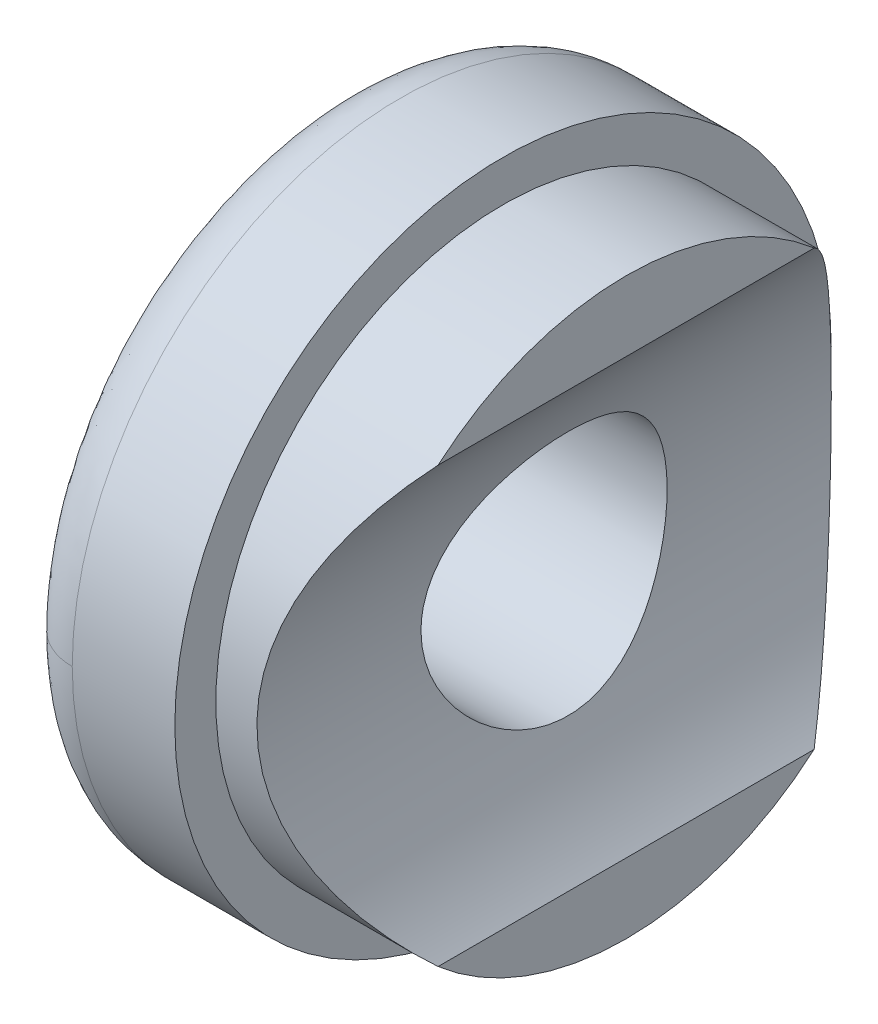
ISO-10303-21;
HEADER;
FILE_DESCRIPTION(('STEP AP214'),'2;1');
FILE_NAME('part.step','',(''),(''),'','','');
FILE_SCHEMA(('AUTOMOTIVE_DESIGN { 1 0 10303 214 1 1 1 1 }'));
ENDSEC;
DATA;
#1=APPLICATION_CONTEXT('core data for automotive mechanical design processes');
#2=APPLICATION_PROTOCOL_DEFINITION('international standard','automotive_design',2000,#1);
#3=PRODUCT_CONTEXT('',#1,'mechanical');
#4=PRODUCT('Part','Part','',(#3));
#5=PRODUCT_RELATED_PRODUCT_CATEGORY('part','',(#4));
#6=PRODUCT_DEFINITION_FORMATION('','',#4);
#7=PRODUCT_DEFINITION_CONTEXT('part definition',#1,'design');
#8=PRODUCT_DEFINITION('design','',#6,#7);
#9=PRODUCT_DEFINITION_SHAPE('','',#8);
#10=(LENGTH_UNIT() NAMED_UNIT(*) SI_UNIT(.MILLI.,.METRE.));
#11=(NAMED_UNIT(*) PLANE_ANGLE_UNIT() SI_UNIT($,.RADIAN.));
#12=(NAMED_UNIT(*) SI_UNIT($,.STERADIAN.) SOLID_ANGLE_UNIT());
#13=UNCERTAINTY_MEASURE_WITH_UNIT(LENGTH_MEASURE(1.E-05),#10,'distance_accuracy_value','');
#14=(GEOMETRIC_REPRESENTATION_CONTEXT(3) GLOBAL_UNCERTAINTY_ASSIGNED_CONTEXT((#13)) GLOBAL_UNIT_ASSIGNED_CONTEXT((#10,
#11,#12)) REPRESENTATION_CONTEXT('',''));
#15=CARTESIAN_POINT('',(0.,0.,0.));
#16=DIRECTION('',(0.,0.,1.));
#17=DIRECTION('',(1.,0.,0.));
#18=AXIS2_PLACEMENT_3D('',#15,#16,#17);
#19=CARTESIAN_POINT('',(-2.,0.,0.));
#20=DIRECTION('',(1.,0.,0.));
#21=DIRECTION('',(0.,0.,-1.));
#22=AXIS2_PLACEMENT_3D('',#19,#20,#21);
#23=CYLINDRICAL_SURFACE('',#22,8.);
#24=CARTESIAN_POINT('',(-2.00000000069092,0.,0.));
#25=DIRECTION('',(-1.,0.,0.));
#26=DIRECTION('',(0.,-1.,0.));
#27=AXIS2_PLACEMENT_3D('',#24,#25,#26);
#28=CIRCLE('',#27,8.00000000006114);
#29=CARTESIAN_POINT('',(-2.00000000069092,-3.59174513714932E-10,-8.00000000004586));
#30=VERTEX_POINT('',#29);
#31=CARTESIAN_POINT('',(-2.00000000069092,-1.23062057109355E-09,8.00000000004585));
#32=VERTEX_POINT('',#31);
#33=EDGE_CURVE('E79',#30,#32,#28,.T.);
#34=ORIENTED_EDGE('',*,*,#33,.F.);
#35=CARTESIAN_POINT('',(-2.00000000069092,0.,0.));
#36=DIRECTION('',(-1.,0.,0.));
#37=DIRECTION('',(0.,-1.,0.));
#38=AXIS2_PLACEMENT_3D('',#35,#36,#37);
#39=CIRCLE('',#38,8.00000000006114);
#40=EDGE_CURVE('E75',#32,#30,#39,.T.);
#41=ORIENTED_EDGE('',*,*,#40,.F.);
#42=EDGE_LOOP('',(#34,#41));
#43=FACE_BOUND('',#42,.T.);
#44=CARTESIAN_POINT('',(0.5,0.,0.));
#45=DIRECTION('',(1.,0.,0.));
#46=DIRECTION('',(0.,0.,-1.));
#47=AXIS2_PLACEMENT_3D('',#44,#45,#46);
#48=CIRCLE('',#47,8.);
#49=CARTESIAN_POINT('',(0.5,0.,-8.));
#50=VERTEX_POINT('',#49);
#51=EDGE_CURVE('E22',#50,#50,#48,.T.);
#52=ORIENTED_EDGE('',*,*,#51,.F.);
#53=EDGE_LOOP('',(#52));
#54=FACE_BOUND('',#53,.T.);
#55=ADVANCED_FACE('F17',(#43,#54),#23,.T.);
#56=CARTESIAN_POINT('',(0.5,-8.096,8.096));
#57=DIRECTION('',(1.,0.,0.));
#58=DIRECTION('',(0.,0.,-1.));
#59=AXIS2_PLACEMENT_3D('',#56,#57,#58);
#60=PLANE('',#59);
#61=CARTESIAN_POINT('',(0.5,0.,0.));
#62=DIRECTION('',(1.,0.,0.));
#63=DIRECTION('',(0.,0.,-1.));
#64=AXIS2_PLACEMENT_3D('',#61,#62,#63);
#65=CIRCLE('',#64,7.);
#66=CARTESIAN_POINT('',(0.5,0.,-7.));
#67=VERTEX_POINT('',#66);
#68=EDGE_CURVE('E69',#67,#67,#65,.F.);
#69=ORIENTED_EDGE('',*,*,#68,.T.);
#70=EDGE_LOOP('',(#69));
#71=FACE_BOUND('',#70,.T.);
#72=ORIENTED_EDGE('',*,*,#51,.T.);
#73=EDGE_LOOP('',(#72));
#74=FACE_BOUND('',#73,.T.);
#75=ADVANCED_FACE('F119',(#71,#74),#60,.T.);
#76=CARTESIAN_POINT('',(-1.850249875,0.,-7.992506248));
#77=CARTESIAN_POINT('',(-1.850249875,15.985012496,-7.992506248));
#78=CARTESIAN_POINT('',(-1.850249875,15.985012496,7.992506248));
#79=CARTESIAN_POINT('',(-1.850249875,0.,7.992506248));
#80=CARTESIAN_POINT('',(-2.870080648,0.,-8.094830634));
#81=CARTESIAN_POINT('',(-2.870080648,16.189661268,-8.094830634));
#82=CARTESIAN_POINT('',(-2.870080648,16.189661268,8.094830634));
#83=CARTESIAN_POINT('',(-2.870080648,0.,8.094830634));
#84=CARTESIAN_POINT('',(-3.594830634,0.,-7.37008064800001));
#85=CARTESIAN_POINT('',(-3.594830634,14.740161296,-7.370080648));
#86=CARTESIAN_POINT('',(-3.594830634,14.740161296,7.370080648));
#87=CARTESIAN_POINT('',(-3.594830634,0.,7.37008064800001));
#88=CARTESIAN_POINT('',(-3.492506248,0.,-6.350249875));
#89=CARTESIAN_POINT('',(-3.492506248,12.70049975,-6.350249875));
#90=CARTESIAN_POINT('',(-3.492506248,12.70049975,6.350249875));
#91=CARTESIAN_POINT('',(-3.492506248,0.,6.350249875));
#92=(BOUNDED_SURFACE() B_SPLINE_SURFACE(3,3,((#76,#77,#78,#79),(#80,#81,#82,#83),(#84,#85,#86,
#87),(#88,#89,#90,#91)),.UNSPECIFIED.,.F.,.F.,.F.) B_SPLINE_SURFACE_WITH_KNOTS((4,4),(4,4),(0.,
1.),(0.,1.),.UNSPECIFIED.) GEOMETRIC_REPRESENTATION_ITEM() RATIONAL_B_SPLINE_SURFACE(((1.,
0.333333333333333,0.333333333333333,1.),(0.755320871117969,0.25177362370599,0.25177362370599,
0.755320871117969),(0.755320871117969,0.25177362370599,0.25177362370599,0.755320871117969),(1.,
0.333333333333333,0.333333333333333,1.))) REPRESENTATION_ITEM('') SURFACE());
#93=CARTESIAN_POINT('',(-1.850249875,0.,-7.992506248));
#94=CARTESIAN_POINT('',(-2.870080648,0.,-8.094830634));
#95=CARTESIAN_POINT('',(-3.594830634,0.,-7.37008064800001));
#96=CARTESIAN_POINT('',(-3.492506248,0.,-6.350249875));
#97=(BOUNDED_CURVE() B_SPLINE_CURVE(3,(#93,#94,#95,#96),.UNSPECIFIED.,.F.,
.F.) B_SPLINE_CURVE_WITH_KNOTS((4,4),(0.,1.),
.UNSPECIFIED.) CURVE() GEOMETRIC_REPRESENTATION_ITEM() RATIONAL_B_SPLINE_CURVE((1.,
0.755320871117969,0.755320871117969,1.)) REPRESENTATION_ITEM(''));
#98=CARTESIAN_POINT('',(-3.50000000003669,0.,-6.49999999912502));
#99=VERTEX_POINT('',#98);
#100=EDGE_CURVE('E73',#99,#30,#97,.F.);
#101=CARTESIAN_POINT('',(-3.50000000006114,0.,-6.50000000069108));
#102=CARTESIAN_POINT('',(-3.50000000006114,13.0000000013822,-6.50000000069108));
#103=CARTESIAN_POINT('',(-3.50000000006114,13.0000000013822,6.50000000069108));
#104=CARTESIAN_POINT('',(-3.50000000006114,0.,6.50000000069108));
#105=(BOUNDED_CURVE() B_SPLINE_CURVE(3,(#101,#102,#103,#104),.UNSPECIFIED.,.F.,
.F.) B_SPLINE_CURVE_WITH_KNOTS((4,4),(0.,1.),
.UNSPECIFIED.) CURVE() GEOMETRIC_REPRESENTATION_ITEM() RATIONAL_B_SPLINE_CURVE((0.95657830216595,
0.318859434055316,0.318859434055316,0.95657830216595)) REPRESENTATION_ITEM(''));
#106=CARTESIAN_POINT('',(-3.50000000003669,0.,6.49999999912502));
#107=VERTEX_POINT('',#106);
#108=EDGE_CURVE('E60',#107,#99,#105,.F.);
#109=CARTESIAN_POINT('',(-1.850249875,0.,7.992506248));
#110=CARTESIAN_POINT('',(-2.870080648,0.,8.094830634));
#111=CARTESIAN_POINT('',(-3.594830634,0.,7.37008064800001));
#112=CARTESIAN_POINT('',(-3.492506248,0.,6.350249875));
#113=(BOUNDED_CURVE() B_SPLINE_CURVE(3,(#109,#110,#111,#112),.UNSPECIFIED.,.F.,
.F.) B_SPLINE_CURVE_WITH_KNOTS((4,4),(0.,1.),
.UNSPECIFIED.) CURVE() GEOMETRIC_REPRESENTATION_ITEM() RATIONAL_B_SPLINE_CURVE((1.,
0.755320871117969,0.755320871117969,1.)) REPRESENTATION_ITEM(''));
#114=EDGE_CURVE('E80',#32,#107,#113,.T.);
#115=ORIENTED_EDGE('',*,*,#40,.T.);
#116=ORIENTED_EDGE('',*,*,#100,.F.);
#117=ORIENTED_EDGE('',*,*,#108,.F.);
#118=ORIENTED_EDGE('',*,*,#114,.F.);
#119=EDGE_LOOP('',(#115,#116,#117,#118));
#120=FACE_BOUND('',#119,.T.);
#121=ADVANCED_FACE('F74',(#120),#92,.T.);
#122=CARTESIAN_POINT('',(-1.850249875,0.,7.992506248));
#123=CARTESIAN_POINT('',(-1.850249875,-15.985012496,7.992506248));
#124=CARTESIAN_POINT('',(-1.850249875,-15.985012496,-7.992506248));
#125=CARTESIAN_POINT('',(-1.850249875,0.,-7.992506248));
#126=CARTESIAN_POINT('',(-2.870080648,0.,8.094830634));
#127=CARTESIAN_POINT('',(-2.870080648,-16.189661268,8.094830634));
#128=CARTESIAN_POINT('',(-2.870080648,-16.189661268,-8.094830634));
#129=CARTESIAN_POINT('',(-2.870080648,0.,-8.094830634));
#130=CARTESIAN_POINT('',(-3.594830634,0.,7.37008064800001));
#131=CARTESIAN_POINT('',(-3.594830634,-14.740161296,7.370080648));
#132=CARTESIAN_POINT('',(-3.594830634,-14.740161296,-7.370080648));
#133=CARTESIAN_POINT('',(-3.594830634,0.,-7.37008064800001));
#134=CARTESIAN_POINT('',(-3.492506248,0.,6.350249875));
#135=CARTESIAN_POINT('',(-3.492506248,-12.70049975,6.350249875));
#136=CARTESIAN_POINT('',(-3.492506248,-12.70049975,-6.350249875));
#137=CARTESIAN_POINT('',(-3.492506248,0.,-6.350249875));
#138=(BOUNDED_SURFACE() B_SPLINE_SURFACE(3,3,((#122,#123,#124,#125),(#126,#127,#128,#129),(#130,
#131,#132,#133),(#134,#135,#136,#137)),.UNSPECIFIED.,.F.,.F.,
.F.) B_SPLINE_SURFACE_WITH_KNOTS((4,4),(4,4),(0.,1.),(0.,1.),
.UNSPECIFIED.) GEOMETRIC_REPRESENTATION_ITEM() RATIONAL_B_SPLINE_SURFACE(((1.,0.333333333333333,
0.333333333333333,1.),(0.755320871117969,0.25177362370599,0.25177362370599,0.755320871117969),
(0.755320871117969,0.25177362370599,0.25177362370599,0.755320871117969),(1.,0.333333333333333,
0.333333333333333,1.))) REPRESENTATION_ITEM('') SURFACE());
#139=CARTESIAN_POINT('',(-3.50000000006114,0.,6.50000000069108));
#140=CARTESIAN_POINT('',(-3.50000000006114,-13.0000000013822,6.50000000069108));
#141=CARTESIAN_POINT('',(-3.50000000006114,-13.0000000013822,-6.50000000069108));
#142=CARTESIAN_POINT('',(-3.50000000006114,0.,-6.50000000069108));
#143=(BOUNDED_CURVE() B_SPLINE_CURVE(3,(#139,#140,#141,#142),.UNSPECIFIED.,.F.,
.F.) B_SPLINE_CURVE_WITH_KNOTS((4,4),(0.,1.),
.UNSPECIFIED.) CURVE() GEOMETRIC_REPRESENTATION_ITEM() RATIONAL_B_SPLINE_CURVE((0.95657830216595,
0.318859434055316,0.318859434055316,0.95657830216595)) REPRESENTATION_ITEM(''));
#144=EDGE_CURVE('E64',#99,#107,#143,.F.);
#145=ORIENTED_EDGE('',*,*,#100,.T.);
#146=ORIENTED_EDGE('',*,*,#33,.T.);
#147=ORIENTED_EDGE('',*,*,#114,.T.);
#148=ORIENTED_EDGE('',*,*,#144,.F.);
#149=EDGE_LOOP('',(#145,#146,#147,#148));
#150=FACE_BOUND('',#149,.T.);
#151=ADVANCED_FACE('F83',(#150),#138,.T.);
#152=CARTESIAN_POINT('',(3.5,5.291502622,4.637566603));
#153=DIRECTION('',(1.,0.,0.));
#154=DIRECTION('',(0.,0.,-1.));
#155=AXIS2_PLACEMENT_3D('',#152,#153,#154);
#156=PLANE('',#155);
#157=DIRECTION('',(0.,0.,-1.));
#158=VECTOR('',#157,1.);
#159=CARTESIAN_POINT('',(3.49999999881671,5.29150262078745,0.));
#160=LINE('',#159,#158);
#161=CARTESIAN_POINT('',(3.49999999926326,5.29150262129379,-4.58257569592046));
#162=VERTEX_POINT('',#161);
#163=CARTESIAN_POINT('',(3.49999999940836,5.29150262145832,4.58257569573049));
#164=VERTEX_POINT('',#163);
#165=EDGE_CURVE('E84',#162,#164,#160,.F.);
#166=ORIENTED_EDGE('',*,*,#165,.F.);
#167=CARTESIAN_POINT('',(3.5,0.,0.));
#168=DIRECTION('',(1.,0.,0.));
#169=DIRECTION('',(0.,0.,-1.));
#170=AXIS2_PLACEMENT_3D('',#167,#168,#169);
#171=CIRCLE('',#170,7.);
#172=EDGE_CURVE('E140',#162,#164,#171,.T.);
#173=ORIENTED_EDGE('',*,*,#172,.T.);
#174=EDGE_LOOP('',(#166,#173));
#175=FACE_BOUND('',#174,.T.);
#176=ADVANCED_FACE('F105',(#175),#156,.T.);
#177=CARTESIAN_POINT('',(3.5,-7.010250984,4.637566603));
#178=DIRECTION('',(1.,0.,0.));
#179=DIRECTION('',(0.,0.,-1.));
#180=AXIS2_PLACEMENT_3D('',#177,#178,#179);
#181=PLANE('',#180);
#182=DIRECTION('',(0.,0.,1.));
#183=VECTOR('',#182,1.);
#184=CARTESIAN_POINT('',(3.49999999786642,-5.29150261970993,0.));
#185=LINE('',#184,#183);
#186=CARTESIAN_POINT('',(3.49999999895033,-5.29150262093897,4.58257569633018));
#187=VERTEX_POINT('',#186);
#188=CARTESIAN_POINT('',(3.49999999893321,-5.29150262091956,-4.58257569635259));
#189=VERTEX_POINT('',#188);
#190=EDGE_CURVE('E87',#187,#189,#185,.F.);
#191=ORIENTED_EDGE('',*,*,#190,.F.);
#192=CARTESIAN_POINT('',(3.5,0.,0.));
#193=DIRECTION('',(1.,0.,0.));
#194=DIRECTION('',(0.,0.,-1.));
#195=AXIS2_PLACEMENT_3D('',#192,#193,#194);
#196=CIRCLE('',#195,7.);
#197=EDGE_CURVE('E40',#187,#189,#196,.T.);
#198=ORIENTED_EDGE('',*,*,#197,.T.);
#199=EDGE_LOOP('',(#191,#198));
#200=FACE_BOUND('',#199,.T.);
#201=ADVANCED_FACE('F180',(#200),#181,.T.);
#202=CARTESIAN_POINT('',(0.5,0.,0.));
#203=DIRECTION('',(1.,0.,0.));
#204=DIRECTION('',(0.,0.,-1.));
#205=AXIS2_PLACEMENT_3D('',#202,#203,#204);
#206=CYLINDRICAL_SURFACE('',#205,7.);
#207=CARTESIAN_POINT('',(3.49999999834896,-5.29150261997508,-4.58257569715826));
#208=CARTESIAN_POINT('',(3.39293276986871,-5.1701150149516,-4.72270241835805));
#209=CARTESIAN_POINT('',(3.28710450214324,-5.04267455661963,-4.85864361556702));
#210=CARTESIAN_POINT('',(3.07941258862584,-4.7754265608018,-5.12158137414986));
#211=CARTESIAN_POINT('',(2.97755498296647,-4.63560116550926,-5.24856452931498));
#212=CARTESIAN_POINT('',(2.77874001318861,-4.34238749711448,-5.49367554355323));
#213=CARTESIAN_POINT('',(2.68183391095157,-4.18889028135742,-5.61171522510102));
#214=CARTESIAN_POINT('',(2.49567795956176,-3.86957247182716,-5.83648018194059));
#215=CARTESIAN_POINT('',(2.40642357120779,-3.70375929472177,-5.94321217424312));
#216=CARTESIAN_POINT('',(2.25440801354188,-3.39481381284013,-6.12376235305814));
#217=CARTESIAN_POINT('',(2.18993612299809,-3.25386105258591,-6.19987513179683));
#218=CARTESIAN_POINT('',(2.06794253163277,-2.96464827389084,-6.34325612642747));
#219=CARTESIAN_POINT('',(2.01041935672737,-2.81638981469223,-6.41052621845371));
#220=CARTESIAN_POINT('',(1.90346049053483,-2.51361760227211,-6.53516886834449));
#221=CARTESIAN_POINT('',(1.85399685047825,-2.35912788869628,-6.59257566946591));
#222=CARTESIAN_POINT('',(1.76383869063227,-2.04416821358017,-6.69693084658516));
#223=CARTESIAN_POINT('',(1.72314280673338,-1.88369918687982,-6.74388084951633));
#224=CARTESIAN_POINT('',(1.65677901175357,-1.58239207290761,-6.82029448072479));
#225=CARTESIAN_POINT('',(1.62977007930605,-1.4422454612337,-6.85132768738137));
#226=CARTESIAN_POINT('',(1.58311992943218,-1.15913073720528,-6.90486516805794));
#227=CARTESIAN_POINT('',(1.56347775651503,-1.01616299329382,-6.92737054816652));
#228=CARTESIAN_POINT('',(1.53188757949636,-0.728140942873773,-6.96354028564235));
#229=CARTESIAN_POINT('',(1.51994613884011,-0.583084963884133,-6.97719710129709));
#230=CARTESIAN_POINT('',(1.5040034170314,-0.29202200521957,-6.99542569449536));
#231=CARTESIAN_POINT('',(1.4999993246924,-0.146015380624692,-7.00000068856661));
#232=CARTESIAN_POINT('',(1.5000007577628,0.163843886618532,-6.99999922735926));
#233=CARTESIAN_POINT('',(1.50504395404564,0.327698797691865,-6.99423717206129));
#234=CARTESIAN_POINT('',(1.52510089817905,0.653996959987093,-6.97130160883884));
#235=CARTESIAN_POINT('',(1.5401155759196,0.816440078120875,-6.95412703664063));
#236=CARTESIAN_POINT('',(1.57977082990941,1.13855155485252,-6.90870123705652));
#237=CARTESIAN_POINT('',(1.60441035441661,1.29822021463508,-6.88045121992361));
#238=CARTESIAN_POINT('',(1.6627815991057,1.61360927429987,-6.81338860049591));
#239=CARTESIAN_POINT('',(1.69651325100418,1.76932970382438,-6.77457607752733));
#240=CARTESIAN_POINT('',(1.77212481757097,2.07473038309513,-6.68734070479756));
#241=CARTESIAN_POINT('',(1.81394398883796,2.22444619329465,-6.63898944688056));
#242=CARTESIAN_POINT('',(1.90513619147715,2.51828398046551,-6.53319755950115));
#243=CARTESIAN_POINT('',(1.95451257321422,2.66240344068341,-6.47575289823902));
#244=CARTESIAN_POINT('',(2.11303348067924,3.08602845982268,-6.29057955014647));
#245=CARTESIAN_POINT('',(2.23245047890723,3.35633339978091,-6.15014799639861));
#246=CARTESIAN_POINT('',(2.4446808522743,3.77571797871992,-5.89748717444974));
#247=CARTESIAN_POINT('',(2.53139198448218,3.93315473648031,-5.79355433260072));
#248=CARTESIAN_POINT('',(2.71168946856017,4.23674073705094,-5.57538615907143));
#249=CARTESIAN_POINT('',(2.80527943311123,4.38288396478436,-5.4611454065262));
#250=CARTESIAN_POINT('',(2.99708352405738,4.66268830409955,-5.22424757570667));
#251=CARTESIAN_POINT('',(3.09526139877821,4.79642838817299,-5.10165382180007));
#252=CARTESIAN_POINT('',(3.29524649768755,5.05246540279179,-4.84818494223726));
#253=CARTESIAN_POINT('',(3.39704890736049,5.17477678460411,-4.71732063552042));
#254=CARTESIAN_POINT('',(3.49999999851853,5.29150262044936,-4.58257569689553));
#255=B_SPLINE_CURVE_WITH_KNOTS('',3,(#207,#208,#209,#210,#211,#212,#213,#214,#215,#216,#217,
#218,#219,#220,#221,#222,#223,#224,#225,#226,#227,#228,#229,#230,#231,#232,#233,#234,#235,#236,
#237,#238,#239,#240,#241,#242,#243,#244,#245,#246,#247,#248,#249,#250,#251,#252,#253,#254),
.UNSPECIFIED.,.F.,.F.,(4,2,2,2,2,2,2,2,2,2,2,2,2,2,2,2,2,2,2,2,2,2,2,4),(0.,0.642245620859644,
1.28543285723364,1.93430433516148,2.5827881824223,3.10034798975225,3.61779780965235,
4.13341316650055,4.64894824459456,5.0866931138393,5.52438118661054,5.96244181591311,
6.40034726866698,6.89172106958792,7.3831406999818,7.87450664617749,8.3658689022339,
8.85367472835332,9.34169744495156,10.319230444829,10.9415304972408,11.5641597422595,
12.1825045170628,12.8000565209903),.UNSPECIFIED.);
#256=EDGE_CURVE('E35',#189,#162,#255,.T.);
#257=ORIENTED_EDGE('',*,*,#256,.F.);
#258=ORIENTED_EDGE('',*,*,#197,.F.);
#259=CARTESIAN_POINT('',(3.49999999822854,5.29150262044347,4.58257569722861));
#260=CARTESIAN_POINT('',(3.39293276988479,5.17011501519132,4.72270241830707));
#261=CARTESIAN_POINT('',(3.28710450221702,5.04267455677053,4.85864361546487));
#262=CARTESIAN_POINT('',(3.07941258874234,4.77542656089565,5.12158137401115));
#263=CARTESIAN_POINT('',(2.97755498306799,4.63560116563476,5.24856452919075));
#264=CARTESIAN_POINT('',(2.77874001327541,4.34238749726693,5.49367554344526));
#265=CARTESIAN_POINT('',(2.68183391103893,4.18889028150457,5.61171522499444));
#266=CARTESIAN_POINT('',(2.49567795964571,3.86957247197388,5.83648018184031));
#267=CARTESIAN_POINT('',(2.4064235712877,3.70375929487348,5.94321217414786));
#268=CARTESIAN_POINT('',(2.25440801361442,3.39481381299608,6.12376235297226));
#269=CARTESIAN_POINT('',(2.18993612306719,3.25386105274153,6.19987513171535));
#270=CARTESIAN_POINT('',(2.06794253169461,2.96464827404565,6.34325612635504));
#271=CARTESIAN_POINT('',(2.01041935678539,2.81638981484657,6.41052621838594));
#272=CARTESIAN_POINT('',(1.9034604905852,2.5136176024246,6.53516886828594));
#273=CARTESIAN_POINT('',(1.85399685052481,2.35912788884737,6.59257566941192));
#274=CARTESIAN_POINT('',(1.7638386906713,2.04416821372806,6.69693084654009));
#275=CARTESIAN_POINT('',(1.72314280676869,1.88369918702591,6.74388084947562));
#276=CARTESIAN_POINT('',(1.65677901170172,1.58239207268428,6.82029448078454));
#277=CARTESIAN_POINT('',(1.62977007918903,1.44224546063349,6.85132768751585));
#278=CARTESIAN_POINT('',(1.58311992922502,1.15913073583808,6.90486516829552));
#279=CARTESIAN_POINT('',(1.5634777562829,1.01616299153654,6.92737054843248));
#280=CARTESIAN_POINT('',(1.53188757925679,0.728140940330037,6.96354028591648));
#281=CARTESIAN_POINT('',(1.51994613861811,0.583084960944019,6.97719710155099));
#282=CARTESIAN_POINT('',(1.50400341688803,0.292022001489367,6.99542569465923));
#283=CARTESIAN_POINT('',(1.49999932461005,0.146015376500781,7.00000068866072));
#284=CARTESIAN_POINT('',(1.5000007578552,-0.163843891184943,6.99999922725366));
#285=CARTESIAN_POINT('',(1.5050439542338,-0.327698802305631,6.99423717184625));
#286=CARTESIAN_POINT('',(1.52510089856307,-0.653996964681265,6.97130160839959));
#287=CARTESIAN_POINT('',(1.54011557640369,-0.816440082848097,6.95412703608661));
#288=CARTESIAN_POINT('',(1.5797708305956,-1.13855155963136,6.90870123626995));
#289=CARTESIAN_POINT('',(1.6044103552048,-1.2982202194325,6.88045121901926));
#290=CARTESIAN_POINT('',(1.66278160009767,-1.61360927912078,6.81338859935504));
#291=CARTESIAN_POINT('',(1.6965132520979,-1.7693297086502,6.77457607626769));
#292=CARTESIAN_POINT('',(1.77212481886502,-2.0747303879168,6.68734070330236));
#293=CARTESIAN_POINT('',(1.81394399023053,-2.22444619810739,6.63898944526862));
#294=CARTESIAN_POINT('',(1.90513619306312,-2.51828398524955,6.53319755765771));
#295=CARTESIAN_POINT('',(1.95451257489509,-2.66240344544766,6.4757528962808));
#296=CARTESIAN_POINT('',(2.11303348263705,-3.08602846451069,6.29057954784877));
#297=CARTESIAN_POINT('',(2.23245048103986,-3.3563334043987,6.15014799388046));
#298=CARTESIAN_POINT('',(2.44468085441388,-3.77571798269009,5.8974871718894));
#299=CARTESIAN_POINT('',(2.53139198643542,-3.93315473991676,5.79355433025003));
#300=CARTESIAN_POINT('',(2.71168947009156,-4.2367407394821,5.57538615720555));
#301=CARTESIAN_POINT('',(2.80527943440704,-4.38288396674406,5.4611454049356));
#302=CARTESIAN_POINT('',(2.99708352484983,-4.66268830518666,5.22424757471803));
#303=CARTESIAN_POINT('',(3.0952613993032,-4.79642838885836,5.10165382113761));
#304=CARTESIAN_POINT('',(3.29524649765706,-5.05246540273953,4.84818494227304));
#305=CARTESIAN_POINT('',(3.39704890704206,-5.17477678421573,4.71732063592808));
#306=CARTESIAN_POINT('',(3.49999999790719,-5.29150261975616,4.58257569769597));
#307=B_SPLINE_CURVE_WITH_KNOTS('',3,(#259,#260,#261,#262,#263,#264,#265,#266,#267,#268,#269,
#270,#271,#272,#273,#274,#275,#276,#277,#278,#279,#280,#281,#282,#283,#284,#285,#286,#287,#288,
#289,#290,#291,#292,#293,#294,#295,#296,#297,#298,#299,#300,#301,#302,#303,#304,#305,#306),
.UNSPECIFIED.,.F.,.F.,(4,2,2,2,2,2,2,2,2,2,2,2,2,2,2,2,2,2,2,2,2,2,2,4),(0.,0.642245620835647,
1.28543285720174,1.93430433513845,2.58278818240194,3.10034798974195,3.61779780965266,
4.13341316651233,4.64894824461788,5.08669311502758,5.52438118896367,5.96244181943217,
6.40034727335035,6.89172107443319,7.3831407049883,7.87450665134483,8.36586890756226,
8.85367473383699,9.3416974505907,10.3192304507696,10.9415305014255,11.5641597446828,
12.1825045177459,12.8000565199441),.UNSPECIFIED.);
#308=EDGE_CURVE('E148',#164,#187,#307,.T.);
#309=ORIENTED_EDGE('',*,*,#308,.F.);
#310=ORIENTED_EDGE('',*,*,#172,.F.);
#311=EDGE_LOOP('',(#257,#258,#309,#310));
#312=FACE_BOUND('',#311,.T.);
#313=ORIENTED_EDGE('',*,*,#68,.F.);
#314=EDGE_LOOP('',(#313));
#315=FACE_BOUND('',#314,.T.);
#316=ADVANCED_FACE('F106',(#312,#315),#206,.T.);
#317=CARTESIAN_POINT('',(-3.5,-6.578,-6.578));
#318=DIRECTION('',(-1.,0.,0.));
#319=DIRECTION('',(0.,0.,1.));
#320=AXIS2_PLACEMENT_3D('',#317,#318,#319);
#321=PLANE('',#320);
#322=CARTESIAN_POINT('',(-3.5,0.,0.));
#323=DIRECTION('',(1.,0.,0.));
#324=DIRECTION('',(0.,1.,0.));
#325=AXIS2_PLACEMENT_3D('',#322,#323,#324);
#326=CIRCLE('',#325,3.);
#327=CARTESIAN_POINT('',(-3.5,3.,0.));
#328=VERTEX_POINT('',#327);
#329=EDGE_CURVE('E27',#328,#328,#326,.F.);
#330=ORIENTED_EDGE('',*,*,#329,.F.);
#331=EDGE_LOOP('',(#330));
#332=FACE_BOUND('',#331,.T.);
#333=ORIENTED_EDGE('',*,*,#108,.T.);
#334=ORIENTED_EDGE('',*,*,#144,.T.);
#335=EDGE_LOOP('',(#333,#334));
#336=FACE_BOUND('',#335,.T.);
#337=ADVANCED_FACE('F19',(#332,#336),#321,.T.);
#338=CARTESIAN_POINT('',(9.5,0.,-7.08400000308685));
#339=DIRECTION('',(0.,0.,1.));
#340=DIRECTION('',(1.,0.,0.));
#341=AXIS2_PLACEMENT_3D('',#338,#339,#340);
#342=CYLINDRICAL_SURFACE('',#341,8.);
#343=ORIENTED_EDGE('',*,*,#190,.T.);
#344=ORIENTED_EDGE('',*,*,#256,.T.);
#345=ORIENTED_EDGE('',*,*,#165,.T.);
#346=ORIENTED_EDGE('',*,*,#308,.T.);
#347=EDGE_LOOP('',(#343,#344,#345,#346));
#348=FACE_BOUND('',#347,.T.);
#349=CARTESIAN_POINT('',(1.5,-1.23062027781043E-09,3.));
#350=CARTESIAN_POINT('',(1.50000820743586,-0.162218843544268,2.99998883534917));
#351=CARTESIAN_POINT('',(1.50498727600021,-0.324597249095,2.98677829575628));
#352=CARTESIAN_POINT('',(1.52439863104118,-0.644673506202279,2.93441368026068));
#353=CARTESIAN_POINT('',(1.53884534961639,-0.802363827188973,2.89521999565563));
#354=CARTESIAN_POINT('',(1.57562720087104,-1.10813814711532,2.79248449840545));
#355=CARTESIAN_POINT('',(1.59794175817633,-1.25624602101754,2.72900615668456));
#356=CARTESIAN_POINT('',(1.64823341277078,-1.53964440113073,2.57975987181266));
#357=CARTESIAN_POINT('',(1.67621021046541,-1.67493558492918,2.49399310789512));
#358=CARTESIAN_POINT('',(1.7362744154236,-1.93468912102483,2.29877716617641));
#359=CARTESIAN_POINT('',(1.76847847235109,-2.05853554821637,2.18854456625731));
#360=CARTESIAN_POINT('',(1.83279407838621,-2.28648378005302,1.94918513082487));
#361=CARTESIAN_POINT('',(1.86490559097476,-2.39057862507851,1.82005166373289));
#362=CARTESIAN_POINT('',(1.92675061562988,-2.57996406685501,1.54056495517547));
#363=CARTESIAN_POINT('',(1.95634706623248,-2.66438796867371,1.38959105457202));
#364=CARTESIAN_POINT('',(2.00800282443543,-2.80637301877442,1.0743030669316));
#365=CARTESIAN_POINT('',(2.03006515186569,-2.86394493327217,0.909994357518315));
#366=CARTESIAN_POINT('',(2.06291175099095,-2.94816863485503,0.579766446003177));
#367=CARTESIAN_POINT('',(2.07412152284479,-2.97599188520052,0.414189774442476));
#368=CARTESIAN_POINT('',(2.08523877085344,-3.00359113446689,0.0803675345360891));
#369=CARTESIAN_POINT('',(2.08515092467542,-3.00337874126812,-0.0878769003983022));
#370=CARTESIAN_POINT('',(2.07404977690266,-2.97580860600619,-0.411538762485266));
#371=CARTESIAN_POINT('',(2.06369065962917,-2.9500762270303,-0.567121243306487));
#372=CARTESIAN_POINT('',(2.03430131134192,-2.87488358023052,-0.87157373714449));
#373=CARTESIAN_POINT('',(2.01526974231835,-2.82541965097524,-1.02044271048652));
#374=CARTESIAN_POINT('',(1.97028542824861,-2.70327340893423,-1.31055753141689));
#375=CARTESIAN_POINT('',(1.94420841718312,-2.63016906312455,-1.45160558131593));
#376=CARTESIAN_POINT('',(1.8881144393448,-2.46311770166687,-1.71989720813518));
#377=CARTESIAN_POINT('',(1.85809629365352,-2.36916444362041,-1.84713663357217));
#378=CARTESIAN_POINT('',(1.79504412992215,-2.15565035499433,-2.09318831680622));
#379=CARTESIAN_POINT('',(1.76194286864432,-2.03479468627977,-2.21086303929098));
#380=CARTESIAN_POINT('',(1.69817525380397,-1.77467657041069,-2.42464435168329));
#381=CARTESIAN_POINT('',(1.6675100285572,-1.63540567240533,-2.52074098432439));
#382=CARTESIAN_POINT('',(1.61144823291258,-1.33929583001897,-2.68993613639372));
#383=CARTESIAN_POINT('',(1.5861445327601,-1.18220993942707,-2.76263907590213));
#384=CARTESIAN_POINT('',(1.55481581935546,-0.938513255722323,-2.85073292519734));
#385=CARTESIAN_POINT('',(1.54547977101842,-0.855970615100866,-2.87659802549555));
#386=CARTESIAN_POINT('',(1.52926199517106,-0.688746253298696,-2.92114720932683));
#387=CARTESIAN_POINT('',(1.52237920085845,-0.604065479086161,-2.93983441445676));
#388=CARTESIAN_POINT('',(1.5112781084672,-0.433191038774423,-2.96982707476916));
#389=CARTESIAN_POINT('',(1.5070610638556,-0.346996680518748,-2.98112905741677));
#390=CARTESIAN_POINT('',(1.5014198138636,-0.173883499524879,-2.99621850132422));
#391=CARTESIAN_POINT('',(1.49999560005316,-0.0869646789742403,-3.00000598526627));
#392=CARTESIAN_POINT('',(1.50000820740436,0.162218841977155,-2.99998883543319));
#393=CARTESIAN_POINT('',(1.50498727593638,0.324597247523568,-2.98677829592646));
#394=CARTESIAN_POINT('',(1.52439863091477,0.644673504639207,-2.9344136806036));
#395=CARTESIAN_POINT('',(1.5388453494598,0.802363825638556,-2.89521999608487));
#396=CARTESIAN_POINT('',(1.5756272006595,1.10813814560478,-2.79248449900439));
#397=CARTESIAN_POINT('',(1.59794175793998,1.2562460195342,-2.7290061573669));
#398=CARTESIAN_POINT('',(1.64823341249249,1.53964439971428,-2.5797598726575));
#399=CARTESIAN_POINT('',(1.67621021016998,1.67493558355246,-2.4939931088191));
#400=CARTESIAN_POINT('',(1.73627441510194,1.93468911973673,-2.29877716725941));
#401=CARTESIAN_POINT('',(1.76847847202059,2.05853554697814,-2.18854456742067));
#402=CARTESIAN_POINT('',(1.83279407804985,2.28648377892791,-1.94918513214324));
#403=CARTESIAN_POINT('',(1.86490559064138,2.39057862401661,-1.8200516651259));
#404=CARTESIAN_POINT('',(1.92675061531892,2.57996406594543,-1.54056495669842));
#405=CARTESIAN_POINT('',(1.95634706594108,2.66438796785136,-1.38959105614824));
#406=CARTESIAN_POINT('',(2.00800282419521,2.80637301813566,-1.07430306859958));
#407=CARTESIAN_POINT('',(2.03006515165709,2.86394493272975,-0.909994359224766));
#408=CARTESIAN_POINT('',(2.06291175085485,2.94816863451333,-0.579766447745866));
#409=CARTESIAN_POINT('',(2.07412152274799,2.97599188495948,-0.414189776182662));
#410=CARTESIAN_POINT('',(2.08523877083507,3.00359113442209,-0.0803675362519291));
#411=CARTESIAN_POINT('',(2.08515092469621,3.00337874131895,0.0878768987042948));
#412=CARTESIAN_POINT('',(2.07404977699431,2.97580860623446,0.411538760838131));
#413=CARTESIAN_POINT('',(2.06369065975364,2.95007622734286,0.567121241683586));
#414=CARTESIAN_POINT('',(2.03430131152488,2.87488358070443,0.871573735583172));
#415=CARTESIAN_POINT('',(2.01526974252699,2.82541965152623,1.02044270896256));
#416=CARTESIAN_POINT('',(1.97028542850326,2.70327340964143,1.31055752995661));
#417=CARTESIAN_POINT('',(1.94420841745894,2.63016906391415,1.45160557988379));
#418=CARTESIAN_POINT('',(1.88811443965352,2.46311770261798,1.71989720677183));
#419=CARTESIAN_POINT('',(1.85809629397398,2.36916444465063,1.84713663224949));
#420=CARTESIAN_POINT('',(1.79504413025585,2.15565035618283,2.09318831558106));
#421=CARTESIAN_POINT('',(1.76194286897879,2.03479468754699,2.21086303812336));
#422=CARTESIAN_POINT('',(1.69817525412773,1.77467657182857,2.42464435064428));
#423=CARTESIAN_POINT('',(1.66751002886948,1.63540567389517,2.52074098335651));
#424=CARTESIAN_POINT('',(1.61144823318576,1.33929583162321,2.68993613559525));
#425=CARTESIAN_POINT('',(1.58614453300629,1.18220994107143,2.76263907519872));
#426=CARTESIAN_POINT('',(1.55481581955528,0.938513257412777,2.85073292464088));
#427=CARTESIAN_POINT('',(1.54547977120178,0.855970616803921,2.87659802498886));
#428=CARTESIAN_POINT('',(1.52926199532007,0.688746255022191,2.92114720892057));
#429=CARTESIAN_POINT('',(1.52237920098957,0.604065480817491,2.93983441410114));
#430=CARTESIAN_POINT('',(1.51127810852667,0.433191039976913,2.96982707460984));
#431=CARTESIAN_POINT('',(1.50706106387814,0.346996681175262,2.98112905735645));
#432=CARTESIAN_POINT('',(1.50141981384795,0.173883499079949,2.9962185013661));
#433=CARTESIAN_POINT('',(1.49999560003624,0.0869646779738437,3.00000598531135));
#434=CARTESIAN_POINT('',(1.5,-1.23062027781043E-09,3.));
#435=B_SPLINE_CURVE_WITH_KNOTS('',3,(#349,#350,#351,#352,#353,#354,#355,#356,#357,#358,#359,
#360,#361,#362,#363,#364,#365,#366,#367,#368,#369,#370,#371,#372,#373,#374,#375,#376,#377,#378,
#379,#380,#381,#382,#383,#384,#385,#386,#387,#388,#389,#390,#391,#392,#393,#394,#395,#396,#397,
#398,#399,#400,#401,#402,#403,#404,#405,#406,#407,#408,#409,#410,#411,#412,#413,#414,#415,#416,
#417,#418,#419,#420,#421,#422,#423,#424,#425,#426,#427,#428,#429,#430,#431,#432,#433,#434),
.UNSPECIFIED.,.T.,.F.,(4,2,2,2,2,2,2,2,2,2,2,2,2,2,2,2,2,2,2,2,2,2,2,2,2,2,2,2,2,2,2,2,2,2,2,2,
2,2,2,2,2,2,4),(0.,0.486333028633697,0.973409133254566,1.45922080717189,1.945006783048,
2.44946074298519,2.95409212235509,3.47793387343895,4.00156541096242,4.50371773346479,
5.0056621454269,5.47756604963104,5.94954278513603,6.43045921814621,6.91151983768737,
7.42484431120942,7.93840517508598,8.46024226280683,8.72095472427396,8.98155367570573,
9.24227507287576,9.50299568306778,9.98932871166373,10.4764048162515,10.9622164901351,
11.4480024659764,11.9524564258614,12.4570878051796,12.9809295562624,13.5045610937854,
14.0067134163524,14.5086578283785,14.9805617326059,15.4525384681339,15.9334549010956,
16.4145155205885,16.9278399940629,17.4414008578912,17.9632379456345,18.2239504071154,
18.4845493585616,18.7452707573902,19.0059913692405),.UNSPECIFIED.);
#436=CARTESIAN_POINT('',(1.5,-1.23062027781043E-09,3.));
#437=VERTEX_POINT('',#436);
#438=EDGE_CURVE('E11',#437,#437,#435,.T.);
#439=ORIENTED_EDGE('',*,*,#438,.F.);
#440=EDGE_LOOP('',(#439));
#441=FACE_BOUND('',#440,.T.);
#442=ADVANCED_FACE('F159',(#348,#441),#342,.F.);
#443=CARTESIAN_POINT('',(-3.5,0.,0.));
#444=DIRECTION('',(1.,0.,0.));
#445=DIRECTION('',(0.,1.,0.));
#446=AXIS2_PLACEMENT_3D('',#443,#444,#445);
#447=CYLINDRICAL_SURFACE('',#446,3.);
#448=ORIENTED_EDGE('',*,*,#438,.T.);
#449=EDGE_LOOP('',(#448));
#450=FACE_BOUND('',#449,.T.);
#451=ORIENTED_EDGE('',*,*,#329,.T.);
#452=EDGE_LOOP('',(#451));
#453=FACE_BOUND('',#452,.T.);
#454=ADVANCED_FACE('F163',(#450,#453),#447,.F.);
#455=CLOSED_SHELL('',(#55,#75,#121,#151,#176,#201,#316,#337,#442,#454));
#456=MANIFOLD_SOLID_BREP('B1',#455);
#457=ADVANCED_BREP_SHAPE_REPRESENTATION('',(#18,#456),#14);
#458=SHAPE_DEFINITION_REPRESENTATION(#9,#457);
ENDSEC;
END-ISO-10303-21;
